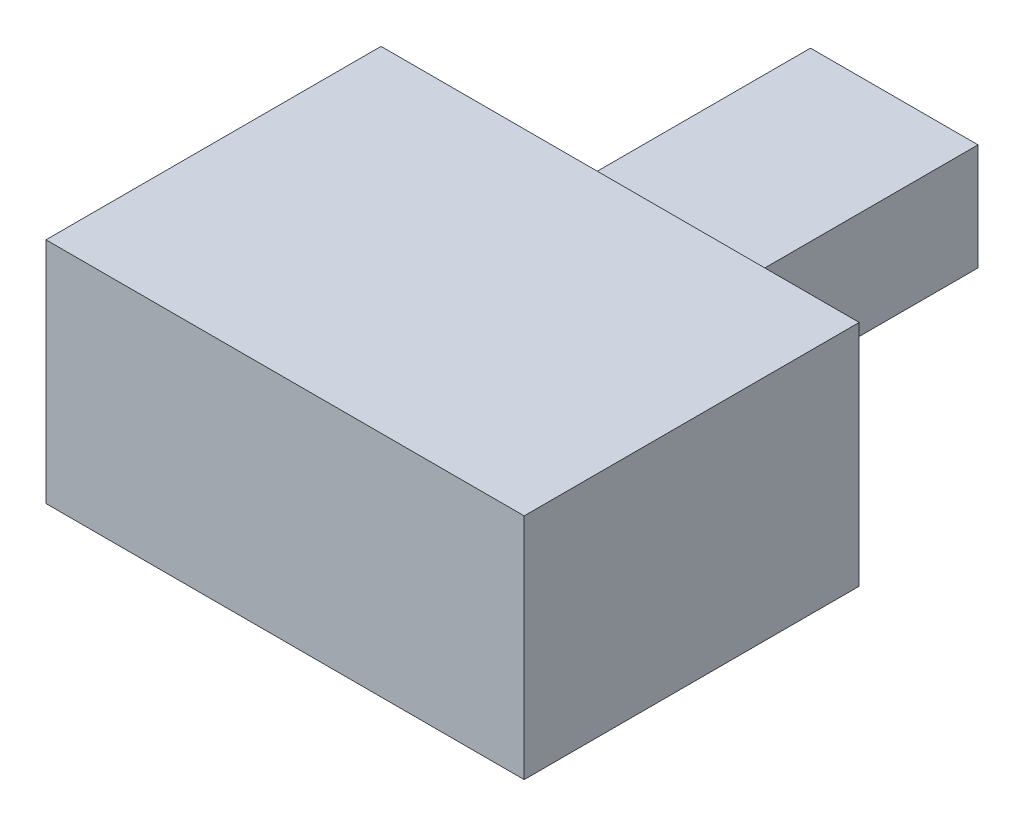
ISO-10303-21;
HEADER;
FILE_DESCRIPTION(('STEP AP214'),'2;1');
FILE_NAME('part.step','',(''),(''),'','','');
FILE_SCHEMA(('AUTOMOTIVE_DESIGN { 1 0 10303 214 1 1 1 1 }'));
ENDSEC;
DATA;
#1=APPLICATION_CONTEXT('core data for automotive mechanical design processes');
#2=APPLICATION_PROTOCOL_DEFINITION('international standard','automotive_design',2000,#1);
#3=PRODUCT_CONTEXT('',#1,'mechanical');
#4=PRODUCT('Part','Part','',(#3));
#5=PRODUCT_RELATED_PRODUCT_CATEGORY('part','',(#4));
#6=PRODUCT_DEFINITION_FORMATION('','',#4);
#7=PRODUCT_DEFINITION_CONTEXT('part definition',#1,'design');
#8=PRODUCT_DEFINITION('design','',#6,#7);
#9=PRODUCT_DEFINITION_SHAPE('','',#8);
#10=(LENGTH_UNIT() NAMED_UNIT(*) SI_UNIT(.MILLI.,.METRE.));
#11=(NAMED_UNIT(*) PLANE_ANGLE_UNIT() SI_UNIT($,.RADIAN.));
#12=(NAMED_UNIT(*) SI_UNIT($,.STERADIAN.) SOLID_ANGLE_UNIT());
#13=UNCERTAINTY_MEASURE_WITH_UNIT(LENGTH_MEASURE(1.E-05),#10,'distance_accuracy_value','');
#14=(GEOMETRIC_REPRESENTATION_CONTEXT(3) GLOBAL_UNCERTAINTY_ASSIGNED_CONTEXT((#13)) GLOBAL_UNIT_ASSIGNED_CONTEXT((#10,
#11,#12)) REPRESENTATION_CONTEXT('',''));
#15=CARTESIAN_POINT('',(0.,0.,0.));
#16=DIRECTION('',(0.,0.,1.));
#17=DIRECTION('',(1.,0.,0.));
#18=AXIS2_PLACEMENT_3D('',#15,#16,#17);
#19=CARTESIAN_POINT('',(7.85,-3.75,11.));
#20=DIRECTION('',(-1.,0.,0.));
#21=DIRECTION('',(0.,0.,1.));
#22=AXIS2_PLACEMENT_3D('',#19,#20,#21);
#23=PLANE('',#22);
#24=DIRECTION('',(0.,1.,0.));
#25=VECTOR('',#24,1.);
#26=CARTESIAN_POINT('',(7.85,-3.75,0.));
#27=LINE('',#26,#25);
#28=CARTESIAN_POINT('',(7.85,-3.75,0.));
#29=VERTEX_POINT('',#28);
#30=CARTESIAN_POINT('',(7.85,3.75,0.));
#31=VERTEX_POINT('',#30);
#32=EDGE_CURVE('E120',#29,#31,#27,.T.);
#33=ORIENTED_EDGE('',*,*,#32,.T.);
#34=DIRECTION('',(0.,0.,-1.));
#35=VECTOR('',#34,1.);
#36=CARTESIAN_POINT('',(7.85,3.75,11.));
#37=LINE('',#36,#35);
#38=CARTESIAN_POINT('',(7.85,3.75,11.));
#39=VERTEX_POINT('',#38);
#40=EDGE_CURVE('E11',#39,#31,#37,.T.);
#41=ORIENTED_EDGE('',*,*,#40,.F.);
#42=DIRECTION('',(0.,1.,0.));
#43=VECTOR('',#42,1.);
#44=CARTESIAN_POINT('',(7.85,-3.75,11.));
#45=LINE('',#44,#43);
#46=CARTESIAN_POINT('',(7.85,-3.75,11.));
#47=VERTEX_POINT('',#46);
#48=EDGE_CURVE('E129',#47,#39,#45,.T.);
#49=ORIENTED_EDGE('',*,*,#48,.F.);
#50=DIRECTION('',(0.,0.,-1.));
#51=VECTOR('',#50,1.);
#52=CARTESIAN_POINT('',(7.85,-3.75,11.));
#53=LINE('',#52,#51);
#54=EDGE_CURVE('E138',#47,#29,#53,.T.);
#55=ORIENTED_EDGE('',*,*,#54,.T.);
#56=EDGE_LOOP('',(#33,#41,#49,#55));
#57=FACE_BOUND('',#56,.T.);
#58=ADVANCED_FACE('F36',(#57),#23,.F.);
#59=CARTESIAN_POINT('',(-7.85,3.75,11.));
#60=DIRECTION('',(0.,-1.,0.));
#61=DIRECTION('',(0.,0.,-1.));
#62=AXIS2_PLACEMENT_3D('',#59,#60,#61);
#63=PLANE('',#62);
#64=DIRECTION('',(-1.,0.,0.));
#65=VECTOR('',#64,1.);
#66=CARTESIAN_POINT('',(-7.85,3.75,0.));
#67=LINE('',#66,#65);
#68=CARTESIAN_POINT('',(-7.85,3.75,0.));
#69=VERTEX_POINT('',#68);
#70=EDGE_CURVE('E123',#31,#69,#67,.T.);
#71=ORIENTED_EDGE('',*,*,#70,.T.);
#72=DIRECTION('',(0.,0.,-1.));
#73=VECTOR('',#72,1.);
#74=CARTESIAN_POINT('',(-7.85,3.75,11.));
#75=LINE('',#74,#73);
#76=CARTESIAN_POINT('',(-7.85,3.75,11.));
#77=VERTEX_POINT('',#76);
#78=EDGE_CURVE('E43',#77,#69,#75,.T.);
#79=ORIENTED_EDGE('',*,*,#78,.F.);
#80=DIRECTION('',(-1.,0.,0.));
#81=VECTOR('',#80,1.);
#82=CARTESIAN_POINT('',(-7.85,3.75,11.));
#83=LINE('',#82,#81);
#84=EDGE_CURVE('E132',#39,#77,#83,.T.);
#85=ORIENTED_EDGE('',*,*,#84,.F.);
#86=ORIENTED_EDGE('',*,*,#40,.T.);
#87=EDGE_LOOP('',(#71,#79,#85,#86));
#88=FACE_BOUND('',#87,.T.);
#89=ADVANCED_FACE('F169',(#88),#63,.F.);
#90=CARTESIAN_POINT('',(-7.85,-3.75,11.));
#91=DIRECTION('',(1.,0.,0.));
#92=DIRECTION('',(0.,0.,-1.));
#93=AXIS2_PLACEMENT_3D('',#90,#91,#92);
#94=PLANE('',#93);
#95=DIRECTION('',(0.,-1.,0.));
#96=VECTOR('',#95,1.);
#97=CARTESIAN_POINT('',(-7.85,-3.75,0.));
#98=LINE('',#97,#96);
#99=CARTESIAN_POINT('',(-7.85,-3.75,0.));
#100=VERTEX_POINT('',#99);
#101=EDGE_CURVE('E141',#69,#100,#98,.T.);
#102=ORIENTED_EDGE('',*,*,#101,.T.);
#103=DIRECTION('',(0.,0.,-1.));
#104=VECTOR('',#103,1.);
#105=CARTESIAN_POINT('',(-7.85,-3.75,11.));
#106=LINE('',#105,#104);
#107=CARTESIAN_POINT('',(-7.85,-3.75,11.));
#108=VERTEX_POINT('',#107);
#109=EDGE_CURVE('E146',#108,#100,#106,.T.);
#110=ORIENTED_EDGE('',*,*,#109,.F.);
#111=DIRECTION('',(0.,-1.,0.));
#112=VECTOR('',#111,1.);
#113=CARTESIAN_POINT('',(-7.85,-3.75,11.));
#114=LINE('',#113,#112);
#115=EDGE_CURVE('E135',#77,#108,#114,.T.);
#116=ORIENTED_EDGE('',*,*,#115,.F.);
#117=ORIENTED_EDGE('',*,*,#78,.T.);
#118=EDGE_LOOP('',(#102,#110,#116,#117));
#119=FACE_BOUND('',#118,.T.);
#120=ADVANCED_FACE('F153',(#119),#94,.F.);
#121=CARTESIAN_POINT('',(-7.85,-3.75,11.));
#122=DIRECTION('',(0.,1.,0.));
#123=DIRECTION('',(0.,0.,1.));
#124=AXIS2_PLACEMENT_3D('',#121,#122,#123);
#125=PLANE('',#124);
#126=DIRECTION('',(1.,0.,0.));
#127=VECTOR('',#126,1.);
#128=CARTESIAN_POINT('',(-7.85,-3.75,0.));
#129=LINE('',#128,#127);
#130=EDGE_CURVE('E133',#100,#29,#129,.T.);
#131=ORIENTED_EDGE('',*,*,#130,.T.);
#132=ORIENTED_EDGE('',*,*,#54,.F.);
#133=DIRECTION('',(1.,0.,0.));
#134=VECTOR('',#133,1.);
#135=CARTESIAN_POINT('',(-7.85,-3.75,11.));
#136=LINE('',#135,#134);
#137=EDGE_CURVE('E137',#108,#47,#136,.T.);
#138=ORIENTED_EDGE('',*,*,#137,.F.);
#139=ORIENTED_EDGE('',*,*,#109,.T.);
#140=EDGE_LOOP('',(#131,#132,#138,#139));
#141=FACE_BOUND('',#140,.T.);
#142=ADVANCED_FACE('F162',(#141),#125,.F.);
#143=CARTESIAN_POINT('',(0.,0.,11.));
#144=DIRECTION('',(0.,0.,-1.));
#145=DIRECTION('',(-1.,0.,0.));
#146=AXIS2_PLACEMENT_3D('',#143,#144,#145);
#147=PLANE('',#146);
#148=ORIENTED_EDGE('',*,*,#48,.T.);
#149=ORIENTED_EDGE('',*,*,#84,.T.);
#150=ORIENTED_EDGE('',*,*,#115,.T.);
#151=ORIENTED_EDGE('',*,*,#137,.T.);
#152=EDGE_LOOP('',(#148,#149,#150,#151));
#153=FACE_BOUND('',#152,.T.);
#154=ADVANCED_FACE('F168',(#153),#147,.F.);
#155=CARTESIAN_POINT('',(0.,0.,0.));
#156=DIRECTION('',(0.,0.,-1.));
#157=DIRECTION('',(-1.,0.,0.));
#158=AXIS2_PLACEMENT_3D('',#155,#156,#157);
#159=PLANE('',#158);
#160=DIRECTION('',(0.,1.,0.));
#161=VECTOR('',#160,1.);
#162=CARTESIAN_POINT('',(-2.75,-1.75,0.));
#163=LINE('',#162,#161);
#164=CARTESIAN_POINT('',(-2.75,-1.75,0.));
#165=VERTEX_POINT('',#164);
#166=CARTESIAN_POINT('',(-2.75,1.75,0.));
#167=VERTEX_POINT('',#166);
#168=EDGE_CURVE('E50',#165,#167,#163,.T.);
#169=ORIENTED_EDGE('',*,*,#168,.F.);
#170=DIRECTION('',(-1.,0.,0.));
#171=VECTOR('',#170,1.);
#172=CARTESIAN_POINT('',(2.75,-1.75,0.));
#173=LINE('',#172,#171);
#174=CARTESIAN_POINT('',(2.75,-1.75,0.));
#175=VERTEX_POINT('',#174);
#176=EDGE_CURVE('E54',#175,#165,#173,.T.);
#177=ORIENTED_EDGE('',*,*,#176,.F.);
#178=DIRECTION('',(0.,-1.,0.));
#179=VECTOR('',#178,1.);
#180=CARTESIAN_POINT('',(2.75,-1.75,0.));
#181=LINE('',#180,#179);
#182=CARTESIAN_POINT('',(2.75,1.75,0.));
#183=VERTEX_POINT('',#182);
#184=EDGE_CURVE('E263',#183,#175,#181,.T.);
#185=ORIENTED_EDGE('',*,*,#184,.F.);
#186=DIRECTION('',(1.,0.,0.));
#187=VECTOR('',#186,1.);
#188=CARTESIAN_POINT('',(2.75,1.75,0.));
#189=LINE('',#188,#187);
#190=EDGE_CURVE('E269',#167,#183,#189,.T.);
#191=ORIENTED_EDGE('',*,*,#190,.F.);
#192=EDGE_LOOP('',(#169,#177,#185,#191));
#193=FACE_BOUND('',#192,.T.);
#194=ORIENTED_EDGE('',*,*,#32,.F.);
#195=ORIENTED_EDGE('',*,*,#130,.F.);
#196=ORIENTED_EDGE('',*,*,#101,.F.);
#197=ORIENTED_EDGE('',*,*,#70,.F.);
#198=EDGE_LOOP('',(#194,#195,#196,#197));
#199=FACE_BOUND('',#198,.T.);
#200=ADVANCED_FACE('F159',(#193,#199),#159,.T.);
#201=CARTESIAN_POINT('',(-2.75,-1.75,-9.));
#202=DIRECTION('',(1.,0.,0.));
#203=DIRECTION('',(0.,0.,-1.));
#204=AXIS2_PLACEMENT_3D('',#201,#202,#203);
#205=PLANE('',#204);
#206=ORIENTED_EDGE('',*,*,#168,.T.);
#207=DIRECTION('',(0.,0.,1.));
#208=VECTOR('',#207,1.);
#209=CARTESIAN_POINT('',(-2.75,1.75,-9.));
#210=LINE('',#209,#208);
#211=CARTESIAN_POINT('',(-2.75,1.75,-9.));
#212=VERTEX_POINT('',#211);
#213=EDGE_CURVE('E103',#212,#167,#210,.T.);
#214=ORIENTED_EDGE('',*,*,#213,.F.);
#215=DIRECTION('',(0.,1.,0.));
#216=VECTOR('',#215,1.);
#217=CARTESIAN_POINT('',(-2.75,-1.75,-9.));
#218=LINE('',#217,#216);
#219=CARTESIAN_POINT('',(-2.75,-1.75,-9.));
#220=VERTEX_POINT('',#219);
#221=EDGE_CURVE('E109',#220,#212,#218,.T.);
#222=ORIENTED_EDGE('',*,*,#221,.F.);
#223=DIRECTION('',(0.,0.,1.));
#224=VECTOR('',#223,1.);
#225=CARTESIAN_POINT('',(-2.75,-1.75,-9.));
#226=LINE('',#225,#224);
#227=EDGE_CURVE('E261',#220,#165,#226,.T.);
#228=ORIENTED_EDGE('',*,*,#227,.T.);
#229=EDGE_LOOP('',(#206,#214,#222,#228));
#230=FACE_BOUND('',#229,.T.);
#231=ADVANCED_FACE('F119',(#230),#205,.F.);
#232=CARTESIAN_POINT('',(2.75,1.75,-9.));
#233=DIRECTION('',(0.,-1.,0.));
#234=DIRECTION('',(0.,0.,-1.));
#235=AXIS2_PLACEMENT_3D('',#232,#233,#234);
#236=PLANE('',#235);
#237=ORIENTED_EDGE('',*,*,#190,.T.);
#238=DIRECTION('',(0.,0.,1.));
#239=VECTOR('',#238,1.);
#240=CARTESIAN_POINT('',(2.75,1.75,-9.));
#241=LINE('',#240,#239);
#242=CARTESIAN_POINT('',(2.75,1.75,-9.));
#243=VERTEX_POINT('',#242);
#244=EDGE_CURVE('E105',#243,#183,#241,.T.);
#245=ORIENTED_EDGE('',*,*,#244,.F.);
#246=DIRECTION('',(1.,0.,0.));
#247=VECTOR('',#246,1.);
#248=CARTESIAN_POINT('',(2.75,1.75,-9.));
#249=LINE('',#248,#247);
#250=EDGE_CURVE('E98',#212,#243,#249,.T.);
#251=ORIENTED_EDGE('',*,*,#250,.F.);
#252=ORIENTED_EDGE('',*,*,#213,.T.);
#253=EDGE_LOOP('',(#237,#245,#251,#252));
#254=FACE_BOUND('',#253,.T.);
#255=ADVANCED_FACE('F101',(#254),#236,.F.);
#256=CARTESIAN_POINT('',(2.75,-1.75,-9.));
#257=DIRECTION('',(-1.,0.,0.));
#258=DIRECTION('',(0.,0.,1.));
#259=AXIS2_PLACEMENT_3D('',#256,#257,#258);
#260=PLANE('',#259);
#261=ORIENTED_EDGE('',*,*,#184,.T.);
#262=DIRECTION('',(0.,0.,1.));
#263=VECTOR('',#262,1.);
#264=CARTESIAN_POINT('',(2.75,-1.75,-9.));
#265=LINE('',#264,#263);
#266=CARTESIAN_POINT('',(2.75,-1.75,-9.));
#267=VERTEX_POINT('',#266);
#268=EDGE_CURVE('E125',#267,#175,#265,.T.);
#269=ORIENTED_EDGE('',*,*,#268,.F.);
#270=DIRECTION('',(0.,-1.,0.));
#271=VECTOR('',#270,1.);
#272=CARTESIAN_POINT('',(2.75,-1.75,-9.));
#273=LINE('',#272,#271);
#274=EDGE_CURVE('E108',#243,#267,#273,.T.);
#275=ORIENTED_EDGE('',*,*,#274,.F.);
#276=ORIENTED_EDGE('',*,*,#244,.T.);
#277=EDGE_LOOP('',(#261,#269,#275,#276));
#278=FACE_BOUND('',#277,.T.);
#279=ADVANCED_FACE('F187',(#278),#260,.F.);
#280=CARTESIAN_POINT('',(2.75,-1.75,-9.));
#281=DIRECTION('',(0.,1.,0.));
#282=DIRECTION('',(0.,0.,1.));
#283=AXIS2_PLACEMENT_3D('',#280,#281,#282);
#284=PLANE('',#283);
#285=ORIENTED_EDGE('',*,*,#176,.T.);
#286=ORIENTED_EDGE('',*,*,#227,.F.);
#287=DIRECTION('',(-1.,0.,0.));
#288=VECTOR('',#287,1.);
#289=CARTESIAN_POINT('',(2.75,-1.75,-9.));
#290=LINE('',#289,#288);
#291=EDGE_CURVE('E114',#267,#220,#290,.T.);
#292=ORIENTED_EDGE('',*,*,#291,.F.);
#293=ORIENTED_EDGE('',*,*,#268,.T.);
#294=EDGE_LOOP('',(#285,#286,#292,#293));
#295=FACE_BOUND('',#294,.T.);
#296=ADVANCED_FACE('F190',(#295),#284,.F.);
#297=CARTESIAN_POINT('',(0.,0.,-9.));
#298=DIRECTION('',(0.,0.,1.));
#299=DIRECTION('',(1.,0.,0.));
#300=AXIS2_PLACEMENT_3D('',#297,#298,#299);
#301=PLANE('',#300);
#302=ORIENTED_EDGE('',*,*,#221,.T.);
#303=ORIENTED_EDGE('',*,*,#250,.T.);
#304=ORIENTED_EDGE('',*,*,#274,.T.);
#305=ORIENTED_EDGE('',*,*,#291,.T.);
#306=EDGE_LOOP('',(#302,#303,#304,#305));
#307=FACE_BOUND('',#306,.T.);
#308=ADVANCED_FACE('F112',(#307),#301,.F.);
#309=CLOSED_SHELL('',(#58,#89,#120,#142,#154,#200,#231,#255,#279,#296,#308));
#310=MANIFOLD_SOLID_BREP('B2',#309);
#311=ADVANCED_BREP_SHAPE_REPRESENTATION('',(#18,#310),#14);
#312=SHAPE_DEFINITION_REPRESENTATION(#9,#311);
ENDSEC;
END-ISO-10303-21;
